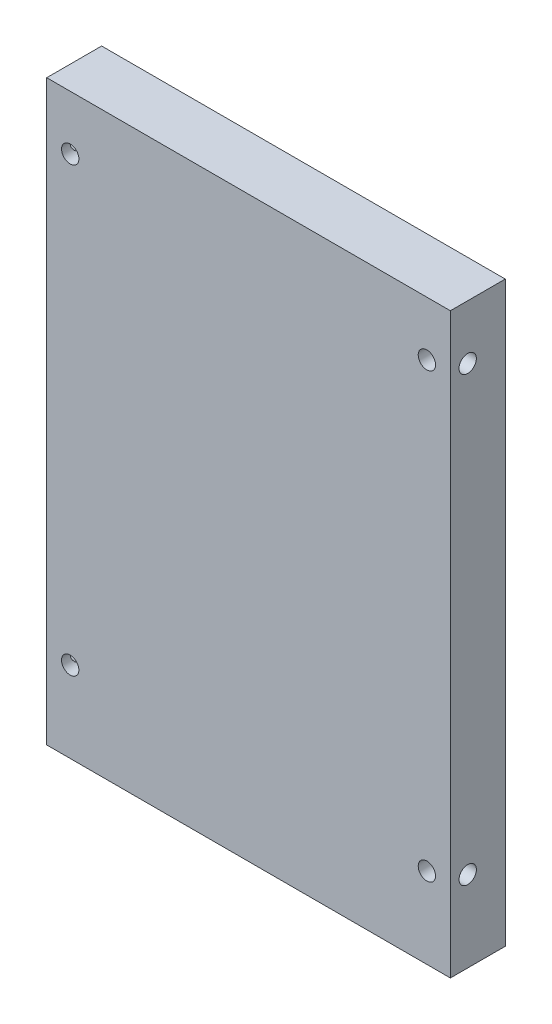
ISO-10303-21;
HEADER;
FILE_DESCRIPTION(('STEP AP214'),'2;1');
FILE_NAME('part.step','',(''),(''),'','','');
FILE_SCHEMA(('AUTOMOTIVE_DESIGN { 1 0 10303 214 1 1 1 1 }'));
ENDSEC;
DATA;
#1=APPLICATION_CONTEXT('core data for automotive mechanical design processes');
#2=APPLICATION_PROTOCOL_DEFINITION('international standard','automotive_design',2000,#1);
#3=PRODUCT_CONTEXT('',#1,'mechanical');
#4=PRODUCT('Part','Part','',(#3));
#5=PRODUCT_RELATED_PRODUCT_CATEGORY('part','',(#4));
#6=PRODUCT_DEFINITION_FORMATION('','',#4);
#7=PRODUCT_DEFINITION_CONTEXT('part definition',#1,'design');
#8=PRODUCT_DEFINITION('design','',#6,#7);
#9=PRODUCT_DEFINITION_SHAPE('','',#8);
#10=(LENGTH_UNIT() NAMED_UNIT(*) SI_UNIT(.MILLI.,.METRE.));
#11=(NAMED_UNIT(*) PLANE_ANGLE_UNIT() SI_UNIT($,.RADIAN.));
#12=(NAMED_UNIT(*) SI_UNIT($,.STERADIAN.) SOLID_ANGLE_UNIT());
#13=UNCERTAINTY_MEASURE_WITH_UNIT(LENGTH_MEASURE(1.E-05),#10,'distance_accuracy_value','');
#14=(GEOMETRIC_REPRESENTATION_CONTEXT(3) GLOBAL_UNCERTAINTY_ASSIGNED_CONTEXT((#13)) GLOBAL_UNIT_ASSIGNED_CONTEXT((#10,
#11,#12)) REPRESENTATION_CONTEXT('',''));
#15=CARTESIAN_POINT('',(0.,0.,0.));
#16=DIRECTION('',(0.,0.,1.));
#17=DIRECTION('',(1.,0.,0.));
#18=AXIS2_PLACEMENT_3D('',#15,#16,#17);
#19=CARTESIAN_POINT('',(0.,0.,9.5));
#20=DIRECTION('',(-1.,0.,0.));
#21=DIRECTION('',(0.,0.,1.));
#22=AXIS2_PLACEMENT_3D('',#19,#20,#21);
#23=PLANE('',#22);
#24=CARTESIAN_POINT('',(0.,14.,6.49999999999999));
#25=DIRECTION('',(1.,0.,0.));
#26=DIRECTION('',(0.,0.,1.));
#27=AXIS2_PLACEMENT_3D('',#24,#25,#26);
#28=CIRCLE('',#27,1.50000000000002);
#29=CARTESIAN_POINT('',(0.,14.,8.00000000000001));
#30=VERTEX_POINT('',#29);
#31=EDGE_CURVE('E204',#30,#30,#28,.T.);
#32=ORIENTED_EDGE('',*,*,#31,.T.);
#33=EDGE_LOOP('',(#32));
#34=FACE_BOUND('',#33,.T.);
#35=CARTESIAN_POINT('',(0.,90.6,6.5));
#36=DIRECTION('',(1.,0.,0.));
#37=DIRECTION('',(0.,0.,-1.));
#38=AXIS2_PLACEMENT_3D('',#35,#36,#37);
#39=CIRCLE('',#38,1.50000000000001);
#40=CARTESIAN_POINT('',(0.,90.6,4.99999999999999));
#41=VERTEX_POINT('',#40);
#42=EDGE_CURVE('E198',#41,#41,#39,.T.);
#43=ORIENTED_EDGE('',*,*,#42,.T.);
#44=EDGE_LOOP('',(#43));
#45=FACE_BOUND('',#44,.T.);
#46=DIRECTION('',(0.,1.,0.));
#47=VECTOR('',#46,1.);
#48=CARTESIAN_POINT('',(0.,0.,0.));
#49=LINE('',#48,#47);
#50=CARTESIAN_POINT('',(0.,0.,0.));
#51=VERTEX_POINT('',#50);
#52=CARTESIAN_POINT('',(0.,100.,0.));
#53=VERTEX_POINT('',#52);
#54=EDGE_CURVE('E176',#51,#53,#49,.T.);
#55=ORIENTED_EDGE('',*,*,#54,.F.);
#56=DIRECTION('',(0.,0.,-1.));
#57=VECTOR('',#56,1.);
#58=CARTESIAN_POINT('',(0.,0.,9.5));
#59=LINE('',#58,#57);
#60=CARTESIAN_POINT('',(0.,0.,9.5));
#61=VERTEX_POINT('',#60);
#62=EDGE_CURVE('E157',#61,#51,#59,.T.);
#63=ORIENTED_EDGE('',*,*,#62,.F.);
#64=DIRECTION('',(0.,1.,0.));
#65=VECTOR('',#64,1.);
#66=CARTESIAN_POINT('',(0.,0.,9.5));
#67=LINE('',#66,#65);
#68=CARTESIAN_POINT('',(0.,100.,9.5));
#69=VERTEX_POINT('',#68);
#70=EDGE_CURVE('E169',#61,#69,#67,.T.);
#71=ORIENTED_EDGE('',*,*,#70,.T.);
#72=DIRECTION('',(0.,0.,-1.));
#73=VECTOR('',#72,1.);
#74=CARTESIAN_POINT('',(0.,100.,9.5));
#75=LINE('',#74,#73);
#76=EDGE_CURVE('E158',#69,#53,#75,.T.);
#77=ORIENTED_EDGE('',*,*,#76,.T.);
#78=EDGE_LOOP('',(#55,#63,#71,#77));
#79=FACE_BOUND('',#78,.T.);
#80=ADVANCED_FACE('F33',(#34,#45,#79),#23,.T.);
#81=CARTESIAN_POINT('',(0.,0.,9.5));
#82=DIRECTION('',(0.,1.,0.));
#83=DIRECTION('',(0.,0.,1.));
#84=AXIS2_PLACEMENT_3D('',#81,#82,#83);
#85=PLANE('',#84);
#86=DIRECTION('',(1.,0.,0.));
#87=VECTOR('',#86,1.);
#88=CARTESIAN_POINT('',(0.,0.,0.));
#89=LINE('',#88,#87);
#90=CARTESIAN_POINT('',(69.85,0.,0.));
#91=VERTEX_POINT('',#90);
#92=EDGE_CURVE('E167',#51,#91,#89,.T.);
#93=ORIENTED_EDGE('',*,*,#92,.T.);
#94=DIRECTION('',(0.,0.,-1.));
#95=VECTOR('',#94,1.);
#96=CARTESIAN_POINT('',(69.85,0.,9.5));
#97=LINE('',#96,#95);
#98=CARTESIAN_POINT('',(69.85,0.,9.5));
#99=VERTEX_POINT('',#98);
#100=EDGE_CURVE('E163',#99,#91,#97,.T.);
#101=ORIENTED_EDGE('',*,*,#100,.F.);
#102=DIRECTION('',(1.,0.,0.));
#103=VECTOR('',#102,1.);
#104=CARTESIAN_POINT('',(0.,0.,9.5));
#105=LINE('',#104,#103);
#106=EDGE_CURVE('E161',#61,#99,#105,.T.);
#107=ORIENTED_EDGE('',*,*,#106,.F.);
#108=ORIENTED_EDGE('',*,*,#62,.T.);
#109=EDGE_LOOP('',(#93,#101,#107,#108));
#110=FACE_BOUND('',#109,.T.);
#111=ADVANCED_FACE('F256',(#110),#85,.F.);
#112=CARTESIAN_POINT('',(69.85,0.,9.5));
#113=DIRECTION('',(-1.,0.,0.));
#114=DIRECTION('',(0.,0.,1.));
#115=AXIS2_PLACEMENT_3D('',#112,#113,#114);
#116=PLANE('',#115);
#117=CARTESIAN_POINT('',(69.85,14.,6.49999999999999));
#118=DIRECTION('',(1.,0.,0.));
#119=DIRECTION('',(0.,0.,1.));
#120=AXIS2_PLACEMENT_3D('',#117,#118,#119);
#121=CIRCLE('',#120,1.50000000000002);
#122=CARTESIAN_POINT('',(69.85,14.,8.00000000000001));
#123=VERTEX_POINT('',#122);
#124=EDGE_CURVE('E193',#123,#123,#121,.T.);
#125=ORIENTED_EDGE('',*,*,#124,.F.);
#126=EDGE_LOOP('',(#125));
#127=FACE_BOUND('',#126,.T.);
#128=CARTESIAN_POINT('',(69.85,90.6,6.5));
#129=DIRECTION('',(1.,0.,0.));
#130=DIRECTION('',(0.,0.,-1.));
#131=AXIS2_PLACEMENT_3D('',#128,#129,#130);
#132=CIRCLE('',#131,1.50000000000001);
#133=CARTESIAN_POINT('',(69.85,90.6,4.99999999999999));
#134=VERTEX_POINT('',#133);
#135=EDGE_CURVE('E188',#134,#134,#132,.T.);
#136=ORIENTED_EDGE('',*,*,#135,.F.);
#137=EDGE_LOOP('',(#136));
#138=FACE_BOUND('',#137,.T.);
#139=DIRECTION('',(0.,1.,0.));
#140=VECTOR('',#139,1.);
#141=CARTESIAN_POINT('',(69.85,0.,0.));
#142=LINE('',#141,#140);
#143=CARTESIAN_POINT('',(69.85,100.,0.));
#144=VERTEX_POINT('',#143);
#145=EDGE_CURVE('E170',#91,#144,#142,.T.);
#146=ORIENTED_EDGE('',*,*,#145,.T.);
#147=DIRECTION('',(0.,0.,-1.));
#148=VECTOR('',#147,1.);
#149=CARTESIAN_POINT('',(69.85,100.,9.5));
#150=LINE('',#149,#148);
#151=CARTESIAN_POINT('',(69.85,100.,9.5));
#152=VERTEX_POINT('',#151);
#153=EDGE_CURVE('E160',#152,#144,#150,.T.);
#154=ORIENTED_EDGE('',*,*,#153,.F.);
#155=DIRECTION('',(0.,1.,0.));
#156=VECTOR('',#155,1.);
#157=CARTESIAN_POINT('',(69.85,0.,9.5));
#158=LINE('',#157,#156);
#159=EDGE_CURVE('E181',#99,#152,#158,.T.);
#160=ORIENTED_EDGE('',*,*,#159,.F.);
#161=ORIENTED_EDGE('',*,*,#100,.T.);
#162=EDGE_LOOP('',(#146,#154,#160,#161));
#163=FACE_BOUND('',#162,.T.);
#164=ADVANCED_FACE('F261',(#127,#138,#163),#116,.F.);
#165=CARTESIAN_POINT('',(0.,100.,9.5));
#166=DIRECTION('',(0.,1.,0.));
#167=DIRECTION('',(0.,0.,1.));
#168=AXIS2_PLACEMENT_3D('',#165,#166,#167);
#169=PLANE('',#168);
#170=DIRECTION('',(1.,0.,0.));
#171=VECTOR('',#170,1.);
#172=CARTESIAN_POINT('',(0.,100.,0.));
#173=LINE('',#172,#171);
#174=EDGE_CURVE('E173',#53,#144,#173,.T.);
#175=ORIENTED_EDGE('',*,*,#174,.F.);
#176=ORIENTED_EDGE('',*,*,#76,.F.);
#177=DIRECTION('',(1.,0.,0.));
#178=VECTOR('',#177,1.);
#179=CARTESIAN_POINT('',(0.,100.,9.5));
#180=LINE('',#179,#178);
#181=EDGE_CURVE('E183',#69,#152,#180,.T.);
#182=ORIENTED_EDGE('',*,*,#181,.T.);
#183=ORIENTED_EDGE('',*,*,#153,.T.);
#184=EDGE_LOOP('',(#175,#176,#182,#183));
#185=FACE_BOUND('',#184,.T.);
#186=ADVANCED_FACE('F239',(#185),#169,.T.);
#187=CARTESIAN_POINT('',(0.,0.,9.5));
#188=DIRECTION('',(0.,0.,-1.));
#189=DIRECTION('',(-1.,0.,0.));
#190=AXIS2_PLACEMENT_3D('',#187,#188,#189);
#191=PLANE('',#190);
#192=CARTESIAN_POINT('',(65.785,14.,9.5));
#193=DIRECTION('',(0.,0.,1.));
#194=DIRECTION('',(-1.,0.,0.));
#195=AXIS2_PLACEMENT_3D('',#192,#193,#194);
#196=CIRCLE('',#195,1.5);
#197=CARTESIAN_POINT('',(64.285,14.,9.5));
#198=VERTEX_POINT('',#197);
#199=EDGE_CURVE('E129',#198,#198,#196,.T.);
#200=ORIENTED_EDGE('',*,*,#199,.F.);
#201=EDGE_LOOP('',(#200));
#202=FACE_BOUND('',#201,.T.);
#203=CARTESIAN_POINT('',(65.785,90.6,9.5));
#204=DIRECTION('',(0.,0.,1.));
#205=DIRECTION('',(-1.,0.,0.));
#206=AXIS2_PLACEMENT_3D('',#203,#204,#205);
#207=CIRCLE('',#206,1.5);
#208=CARTESIAN_POINT('',(64.285,90.6,9.5));
#209=VERTEX_POINT('',#208);
#210=EDGE_CURVE('E226',#209,#209,#207,.T.);
#211=ORIENTED_EDGE('',*,*,#210,.F.);
#212=EDGE_LOOP('',(#211));
#213=FACE_BOUND('',#212,.T.);
#214=CARTESIAN_POINT('',(4.065,14.,9.5));
#215=DIRECTION('',(0.,0.,1.));
#216=DIRECTION('',(1.,0.,0.));
#217=AXIS2_PLACEMENT_3D('',#214,#215,#216);
#218=CIRCLE('',#217,1.5);
#219=CARTESIAN_POINT('',(5.565,14.,9.5));
#220=VERTEX_POINT('',#219);
#221=EDGE_CURVE('E219',#220,#220,#218,.T.);
#222=ORIENTED_EDGE('',*,*,#221,.F.);
#223=EDGE_LOOP('',(#222));
#224=FACE_BOUND('',#223,.T.);
#225=CARTESIAN_POINT('',(4.065,90.6,9.5));
#226=DIRECTION('',(0.,0.,1.));
#227=DIRECTION('',(1.,0.,0.));
#228=AXIS2_PLACEMENT_3D('',#225,#226,#227);
#229=CIRCLE('',#228,1.5);
#230=CARTESIAN_POINT('',(5.565,90.6,9.5));
#231=VERTEX_POINT('',#230);
#232=EDGE_CURVE('E212',#231,#231,#229,.T.);
#233=ORIENTED_EDGE('',*,*,#232,.F.);
#234=EDGE_LOOP('',(#233));
#235=FACE_BOUND('',#234,.T.);
#236=ORIENTED_EDGE('',*,*,#70,.F.);
#237=ORIENTED_EDGE('',*,*,#106,.T.);
#238=ORIENTED_EDGE('',*,*,#159,.T.);
#239=ORIENTED_EDGE('',*,*,#181,.F.);
#240=EDGE_LOOP('',(#236,#237,#238,#239));
#241=FACE_BOUND('',#240,.T.);
#242=ADVANCED_FACE('F235',(#202,#213,#224,#235,#241),#191,.F.);
#243=CARTESIAN_POINT('',(0.,0.,0.));
#244=DIRECTION('',(0.,0.,-1.));
#245=DIRECTION('',(-1.,0.,0.));
#246=AXIS2_PLACEMENT_3D('',#243,#244,#245);
#247=PLANE('',#246);
#248=ORIENTED_EDGE('',*,*,#54,.T.);
#249=ORIENTED_EDGE('',*,*,#174,.T.);
#250=ORIENTED_EDGE('',*,*,#145,.F.);
#251=ORIENTED_EDGE('',*,*,#92,.F.);
#252=EDGE_LOOP('',(#248,#249,#250,#251));
#253=FACE_BOUND('',#252,.T.);
#254=ADVANCED_FACE('F238',(#253),#247,.T.);
#255=CARTESIAN_POINT('',(66.85,90.6,6.5));
#256=DIRECTION('',(1.,0.,0.));
#257=DIRECTION('',(0.,0.,-1.));
#258=AXIS2_PLACEMENT_3D('',#255,#256,#257);
#259=CYLINDRICAL_SURFACE('',#258,1.50000000000001);
#260=CARTESIAN_POINT('',(66.85,90.6,6.5));
#261=DIRECTION('',(1.,0.,0.));
#262=DIRECTION('',(0.,0.,-1.));
#263=AXIS2_PLACEMENT_3D('',#260,#261,#262);
#264=CIRCLE('',#263,1.50000000000001);
#265=CARTESIAN_POINT('',(66.85,89.5436974865125,7.565));
#266=VERTEX_POINT('',#265);
#267=CARTESIAN_POINT('',(66.85,91.6563025134875,7.565));
#268=VERTEX_POINT('',#267);
#269=EDGE_CURVE('E179',#266,#268,#264,.T.);
#270=ORIENTED_EDGE('',*,*,#269,.F.);
#271=CARTESIAN_POINT('',(65.785,90.6,6.5));
#272=DIRECTION('',(0.707106781186547,0.,-0.707106781186547));
#273=DIRECTION('',(0.707106781186547,0.,0.707106781186547));
#274=AXIS2_PLACEMENT_3D('',#271,#272,#273);
#275=ELLIPSE('',#274,2.12132034355964,1.5);
#276=EDGE_CURVE('E222',#266,#268,#275,.F.);
#277=ORIENTED_EDGE('',*,*,#276,.T.);
#278=EDGE_LOOP('',(#270,#277));
#279=FACE_BOUND('',#278,.T.);
#280=ORIENTED_EDGE('',*,*,#135,.T.);
#281=EDGE_LOOP('',(#280));
#282=FACE_BOUND('',#281,.T.);
#283=ADVANCED_FACE('F265',(#279,#282),#259,.F.);
#284=CARTESIAN_POINT('',(66.85,90.6,6.5));
#285=DIRECTION('',(1.,0.,0.));
#286=DIRECTION('',(0.,0.,-1.));
#287=AXIS2_PLACEMENT_3D('',#284,#285,#286);
#288=PLANE('',#287);
#289=DIRECTION('',(0.,0.,1.));
#290=VECTOR('',#289,1.);
#291=CARTESIAN_POINT('',(66.85,91.6563025134875,6.5));
#292=LINE('',#291,#290);
#293=CARTESIAN_POINT('',(66.85,91.6563025134875,6.5));
#294=VERTEX_POINT('',#293);
#295=EDGE_CURVE('E123',#294,#268,#292,.T.);
#296=ORIENTED_EDGE('',*,*,#295,.F.);
#297=DIRECTION('',(0.,1.,0.));
#298=VECTOR('',#297,1.);
#299=CARTESIAN_POINT('',(66.85,90.6,6.5));
#300=LINE('',#299,#298);
#301=CARTESIAN_POINT('',(66.85,89.5436974865125,6.5));
#302=VERTEX_POINT('',#301);
#303=EDGE_CURVE('E139',#302,#294,#300,.T.);
#304=ORIENTED_EDGE('',*,*,#303,.F.);
#305=DIRECTION('',(0.,0.,1.));
#306=VECTOR('',#305,1.);
#307=CARTESIAN_POINT('',(66.85,89.5436974865125,6.5));
#308=LINE('',#307,#306);
#309=EDGE_CURVE('E137',#266,#302,#308,.F.);
#310=ORIENTED_EDGE('',*,*,#309,.F.);
#311=ORIENTED_EDGE('',*,*,#269,.T.);
#312=EDGE_LOOP('',(#296,#304,#310,#311));
#313=FACE_BOUND('',#312,.T.);
#314=ADVANCED_FACE('F270',(#313),#288,.T.);
#315=CARTESIAN_POINT('',(66.85,14.,6.49999999999999));
#316=DIRECTION('',(1.,0.,0.));
#317=DIRECTION('',(0.,0.,-1.));
#318=AXIS2_PLACEMENT_3D('',#315,#316,#317);
#319=CYLINDRICAL_SURFACE('',#318,1.50000000000002);
#320=CARTESIAN_POINT('',(66.85,14.,6.49999999999999));
#321=DIRECTION('',(1.,0.,0.));
#322=DIRECTION('',(0.,0.,1.));
#323=AXIS2_PLACEMENT_3D('',#320,#321,#322);
#324=CIRCLE('',#323,1.50000000000002);
#325=CARTESIAN_POINT('',(66.85,12.9436974865125,7.56499999999999));
#326=VERTEX_POINT('',#325);
#327=CARTESIAN_POINT('',(66.85,15.0563025134875,7.56500000000001));
#328=VERTEX_POINT('',#327);
#329=EDGE_CURVE('E134',#326,#328,#324,.T.);
#330=ORIENTED_EDGE('',*,*,#329,.F.);
#331=CARTESIAN_POINT('',(65.785,14.,6.49999999999999));
#332=DIRECTION('',(0.707106781186547,0.,-0.707106781186547));
#333=DIRECTION('',(0.707106781186547,0.,0.707106781186547));
#334=AXIS2_PLACEMENT_3D('',#331,#332,#333);
#335=ELLIPSE('',#334,2.12132034355965,1.50000000000001);
#336=EDGE_CURVE('E128',#326,#328,#335,.F.);
#337=ORIENTED_EDGE('',*,*,#336,.T.);
#338=EDGE_LOOP('',(#330,#337));
#339=FACE_BOUND('',#338,.T.);
#340=ORIENTED_EDGE('',*,*,#124,.T.);
#341=EDGE_LOOP('',(#340));
#342=FACE_BOUND('',#341,.T.);
#343=ADVANCED_FACE('F295',(#339,#342),#319,.F.);
#344=CARTESIAN_POINT('',(66.85,14.,6.49999999999999));
#345=DIRECTION('',(-1.,0.,0.));
#346=DIRECTION('',(0.,0.,1.));
#347=AXIS2_PLACEMENT_3D('',#344,#345,#346);
#348=PLANE('',#347);
#349=DIRECTION('',(0.,-1.,0.));
#350=VECTOR('',#349,1.);
#351=CARTESIAN_POINT('',(66.85,14.,6.5));
#352=LINE('',#351,#350);
#353=CARTESIAN_POINT('',(66.85,15.0563025134875,6.5));
#354=VERTEX_POINT('',#353);
#355=CARTESIAN_POINT('',(66.85,12.9436974865125,6.5));
#356=VERTEX_POINT('',#355);
#357=EDGE_CURVE('E119',#354,#356,#352,.T.);
#358=ORIENTED_EDGE('',*,*,#357,.T.);
#359=DIRECTION('',(0.,0.,1.));
#360=VECTOR('',#359,1.);
#361=CARTESIAN_POINT('',(66.85,12.9436974865125,6.5));
#362=LINE('',#361,#360);
#363=EDGE_CURVE('E11',#356,#326,#362,.T.);
#364=ORIENTED_EDGE('',*,*,#363,.T.);
#365=ORIENTED_EDGE('',*,*,#329,.T.);
#366=DIRECTION('',(0.,0.,1.));
#367=VECTOR('',#366,1.);
#368=CARTESIAN_POINT('',(66.85,15.0563025134875,6.5));
#369=LINE('',#368,#367);
#370=EDGE_CURVE('E40',#328,#354,#369,.F.);
#371=ORIENTED_EDGE('',*,*,#370,.T.);
#372=EDGE_LOOP('',(#358,#364,#365,#371));
#373=FACE_BOUND('',#372,.T.);
#374=ADVANCED_FACE('F132',(#373),#348,.F.);
#375=CARTESIAN_POINT('',(3.,90.6,6.5));
#376=DIRECTION('',(-1.,0.,0.));
#377=DIRECTION('',(0.,0.,1.));
#378=AXIS2_PLACEMENT_3D('',#375,#376,#377);
#379=CYLINDRICAL_SURFACE('',#378,1.50000000000001);
#380=CARTESIAN_POINT('',(4.065,90.6,6.5));
#381=DIRECTION('',(-0.707106781186547,0.,-0.707106781186547));
#382=DIRECTION('',(-0.707106781186547,0.,0.707106781186547));
#383=AXIS2_PLACEMENT_3D('',#380,#381,#382);
#384=ELLIPSE('',#383,2.12132034355965,1.5);
#385=CARTESIAN_POINT('',(3.,89.5436974865125,7.565));
#386=VERTEX_POINT('',#385);
#387=CARTESIAN_POINT('',(3.,91.6563025134875,7.565));
#388=VERTEX_POINT('',#387);
#389=EDGE_CURVE('E207',#386,#388,#384,.T.);
#390=ORIENTED_EDGE('',*,*,#389,.F.);
#391=CARTESIAN_POINT('',(3.,90.6,6.5));
#392=DIRECTION('',(1.,0.,0.));
#393=DIRECTION('',(0.,0.,-1.));
#394=AXIS2_PLACEMENT_3D('',#391,#392,#393);
#395=CIRCLE('',#394,1.50000000000001);
#396=EDGE_CURVE('E196',#386,#388,#395,.T.);
#397=ORIENTED_EDGE('',*,*,#396,.T.);
#398=EDGE_LOOP('',(#390,#397));
#399=FACE_BOUND('',#398,.T.);
#400=ORIENTED_EDGE('',*,*,#42,.F.);
#401=EDGE_LOOP('',(#400));
#402=FACE_BOUND('',#401,.T.);
#403=ADVANCED_FACE('F283',(#399,#402),#379,.F.);
#404=CARTESIAN_POINT('',(3.,90.6,6.5));
#405=DIRECTION('',(-1.,0.,0.));
#406=DIRECTION('',(0.,0.,-1.));
#407=AXIS2_PLACEMENT_3D('',#404,#405,#406);
#408=PLANE('',#407);
#409=DIRECTION('',(0.,0.,1.));
#410=VECTOR('',#409,1.);
#411=CARTESIAN_POINT('',(3.,89.5436974865125,6.5));
#412=LINE('',#411,#410);
#413=CARTESIAN_POINT('',(3.,89.5436974865125,6.5));
#414=VERTEX_POINT('',#413);
#415=EDGE_CURVE('E149',#414,#386,#412,.T.);
#416=ORIENTED_EDGE('',*,*,#415,.F.);
#417=DIRECTION('',(0.,1.,0.));
#418=VECTOR('',#417,1.);
#419=CARTESIAN_POINT('',(3.,90.6,6.5));
#420=LINE('',#419,#418);
#421=CARTESIAN_POINT('',(3.,91.6563025134875,6.5));
#422=VERTEX_POINT('',#421);
#423=EDGE_CURVE('E154',#414,#422,#420,.T.);
#424=ORIENTED_EDGE('',*,*,#423,.T.);
#425=DIRECTION('',(0.,0.,1.));
#426=VECTOR('',#425,1.);
#427=CARTESIAN_POINT('',(3.,91.6563025134875,6.5));
#428=LINE('',#427,#426);
#429=EDGE_CURVE('E151',#388,#422,#428,.F.);
#430=ORIENTED_EDGE('',*,*,#429,.F.);
#431=ORIENTED_EDGE('',*,*,#396,.F.);
#432=EDGE_LOOP('',(#416,#424,#430,#431));
#433=FACE_BOUND('',#432,.T.);
#434=ADVANCED_FACE('F285',(#433),#408,.T.);
#435=CARTESIAN_POINT('',(3.,14.,6.49999999999999));
#436=DIRECTION('',(-1.,0.,0.));
#437=DIRECTION('',(0.,0.,1.));
#438=AXIS2_PLACEMENT_3D('',#435,#436,#437);
#439=CYLINDRICAL_SURFACE('',#438,1.50000000000002);
#440=CARTESIAN_POINT('',(4.065,14.,6.49999999999999));
#441=DIRECTION('',(-0.707106781186547,0.,-0.707106781186547));
#442=DIRECTION('',(-0.707106781186547,0.,0.707106781186547));
#443=AXIS2_PLACEMENT_3D('',#440,#441,#442);
#444=ELLIPSE('',#443,2.12132034355966,1.50000000000001);
#445=CARTESIAN_POINT('',(3.,12.9436974865125,7.56500000000001));
#446=VERTEX_POINT('',#445);
#447=CARTESIAN_POINT('',(3.,15.0563025134875,7.56499999999999));
#448=VERTEX_POINT('',#447);
#449=EDGE_CURVE('E215',#446,#448,#444,.T.);
#450=ORIENTED_EDGE('',*,*,#449,.F.);
#451=CARTESIAN_POINT('',(3.,14.,6.49999999999999));
#452=DIRECTION('',(1.,0.,0.));
#453=DIRECTION('',(0.,0.,1.));
#454=AXIS2_PLACEMENT_3D('',#451,#452,#453);
#455=CIRCLE('',#454,1.50000000000002);
#456=EDGE_CURVE('E201',#446,#448,#455,.T.);
#457=ORIENTED_EDGE('',*,*,#456,.T.);
#458=EDGE_LOOP('',(#450,#457));
#459=FACE_BOUND('',#458,.T.);
#460=ORIENTED_EDGE('',*,*,#31,.F.);
#461=EDGE_LOOP('',(#460));
#462=FACE_BOUND('',#461,.T.);
#463=ADVANCED_FACE('F292',(#459,#462),#439,.F.);
#464=CARTESIAN_POINT('',(3.,14.,6.49999999999999));
#465=DIRECTION('',(1.,0.,0.));
#466=DIRECTION('',(0.,0.,1.));
#467=AXIS2_PLACEMENT_3D('',#464,#465,#466);
#468=PLANE('',#467);
#469=DIRECTION('',(0.,-1.,0.));
#470=VECTOR('',#469,1.);
#471=CARTESIAN_POINT('',(3.,14.,6.5));
#472=LINE('',#471,#470);
#473=CARTESIAN_POINT('',(3.,15.0563025134875,6.5));
#474=VERTEX_POINT('',#473);
#475=CARTESIAN_POINT('',(3.,12.9436974865125,6.5));
#476=VERTEX_POINT('',#475);
#477=EDGE_CURVE('E147',#474,#476,#472,.T.);
#478=ORIENTED_EDGE('',*,*,#477,.F.);
#479=DIRECTION('',(0.,0.,1.));
#480=VECTOR('',#479,1.);
#481=CARTESIAN_POINT('',(3.,15.0563025134875,6.5));
#482=LINE('',#481,#480);
#483=EDGE_CURVE('E141',#474,#448,#482,.T.);
#484=ORIENTED_EDGE('',*,*,#483,.T.);
#485=ORIENTED_EDGE('',*,*,#456,.F.);
#486=DIRECTION('',(0.,0.,1.));
#487=VECTOR('',#486,1.);
#488=CARTESIAN_POINT('',(3.,12.9436974865125,6.5));
#489=LINE('',#488,#487);
#490=EDGE_CURVE('E144',#446,#476,#489,.F.);
#491=ORIENTED_EDGE('',*,*,#490,.T.);
#492=EDGE_LOOP('',(#478,#484,#485,#491));
#493=FACE_BOUND('',#492,.T.);
#494=ADVANCED_FACE('F376',(#493),#468,.F.);
#495=CARTESIAN_POINT('',(4.065,90.6,6.5));
#496=DIRECTION('',(0.,0.,1.));
#497=DIRECTION('',(1.,0.,0.));
#498=AXIS2_PLACEMENT_3D('',#495,#496,#497);
#499=CYLINDRICAL_SURFACE('',#498,1.5);
#500=ORIENTED_EDGE('',*,*,#415,.T.);
#501=ORIENTED_EDGE('',*,*,#389,.T.);
#502=ORIENTED_EDGE('',*,*,#429,.T.);
#503=CARTESIAN_POINT('',(4.065,90.6,6.5));
#504=DIRECTION('',(0.,0.,1.));
#505=DIRECTION('',(1.,0.,0.));
#506=AXIS2_PLACEMENT_3D('',#503,#504,#505);
#507=CIRCLE('',#506,1.5);
#508=EDGE_CURVE('E211',#414,#422,#507,.T.);
#509=ORIENTED_EDGE('',*,*,#508,.F.);
#510=EDGE_LOOP('',(#500,#501,#502,#509));
#511=FACE_BOUND('',#510,.T.);
#512=ORIENTED_EDGE('',*,*,#232,.T.);
#513=EDGE_LOOP('',(#512));
#514=FACE_BOUND('',#513,.T.);
#515=ADVANCED_FACE('F385',(#511,#514),#499,.F.);
#516=CARTESIAN_POINT('',(4.065,90.6,6.5));
#517=DIRECTION('',(0.,0.,1.));
#518=DIRECTION('',(1.,0.,0.));
#519=AXIS2_PLACEMENT_3D('',#516,#517,#518);
#520=PLANE('',#519);
#521=ORIENTED_EDGE('',*,*,#508,.T.);
#522=ORIENTED_EDGE('',*,*,#423,.F.);
#523=EDGE_LOOP('',(#521,#522));
#524=FACE_BOUND('',#523,.T.);
#525=ADVANCED_FACE('F395',(#524),#520,.T.);
#526=CARTESIAN_POINT('',(4.065,14.,6.5));
#527=DIRECTION('',(0.,0.,1.));
#528=DIRECTION('',(1.,0.,0.));
#529=AXIS2_PLACEMENT_3D('',#526,#527,#528);
#530=CYLINDRICAL_SURFACE('',#529,1.5);
#531=ORIENTED_EDGE('',*,*,#221,.T.);
#532=EDGE_LOOP('',(#531));
#533=FACE_BOUND('',#532,.T.);
#534=CARTESIAN_POINT('',(4.065,14.,6.5));
#535=DIRECTION('',(0.,0.,1.));
#536=DIRECTION('',(1.,0.,0.));
#537=AXIS2_PLACEMENT_3D('',#534,#535,#536);
#538=CIRCLE('',#537,1.5);
#539=EDGE_CURVE('E218',#476,#474,#538,.T.);
#540=ORIENTED_EDGE('',*,*,#539,.F.);
#541=ORIENTED_EDGE('',*,*,#490,.F.);
#542=ORIENTED_EDGE('',*,*,#449,.T.);
#543=ORIENTED_EDGE('',*,*,#483,.F.);
#544=EDGE_LOOP('',(#540,#541,#542,#543));
#545=FACE_BOUND('',#544,.T.);
#546=ADVANCED_FACE('F405',(#533,#545),#530,.F.);
#547=CARTESIAN_POINT('',(4.065,14.,6.5));
#548=DIRECTION('',(0.,0.,1.));
#549=DIRECTION('',(1.,0.,0.));
#550=AXIS2_PLACEMENT_3D('',#547,#548,#549);
#551=PLANE('',#550);
#552=ORIENTED_EDGE('',*,*,#477,.T.);
#553=ORIENTED_EDGE('',*,*,#539,.T.);
#554=EDGE_LOOP('',(#552,#553));
#555=FACE_BOUND('',#554,.T.);
#556=ADVANCED_FACE('F415',(#555),#551,.T.);
#557=CARTESIAN_POINT('',(65.785,90.6,6.5));
#558=DIRECTION('',(0.,0.,1.));
#559=DIRECTION('',(1.,0.,0.));
#560=AXIS2_PLACEMENT_3D('',#557,#558,#559);
#561=CYLINDRICAL_SURFACE('',#560,1.5);
#562=ORIENTED_EDGE('',*,*,#295,.T.);
#563=ORIENTED_EDGE('',*,*,#276,.F.);
#564=ORIENTED_EDGE('',*,*,#309,.T.);
#565=CARTESIAN_POINT('',(65.785,90.6,6.5));
#566=DIRECTION('',(0.,0.,1.));
#567=DIRECTION('',(-1.,0.,0.));
#568=AXIS2_PLACEMENT_3D('',#565,#566,#567);
#569=CIRCLE('',#568,1.5);
#570=EDGE_CURVE('E53',#294,#302,#569,.T.);
#571=ORIENTED_EDGE('',*,*,#570,.F.);
#572=EDGE_LOOP('',(#562,#563,#564,#571));
#573=FACE_BOUND('',#572,.T.);
#574=ORIENTED_EDGE('',*,*,#210,.T.);
#575=EDGE_LOOP('',(#574));
#576=FACE_BOUND('',#575,.T.);
#577=ADVANCED_FACE('F312',(#573,#576),#561,.F.);
#578=CARTESIAN_POINT('',(65.785,90.6,6.5));
#579=DIRECTION('',(0.,0.,-1.));
#580=DIRECTION('',(-1.,0.,0.));
#581=AXIS2_PLACEMENT_3D('',#578,#579,#580);
#582=PLANE('',#581);
#583=ORIENTED_EDGE('',*,*,#303,.T.);
#584=ORIENTED_EDGE('',*,*,#570,.T.);
#585=EDGE_LOOP('',(#583,#584));
#586=FACE_BOUND('',#585,.T.);
#587=ADVANCED_FACE('F434',(#586),#582,.F.);
#588=CARTESIAN_POINT('',(65.785,14.,6.5));
#589=DIRECTION('',(0.,0.,1.));
#590=DIRECTION('',(1.,0.,0.));
#591=AXIS2_PLACEMENT_3D('',#588,#589,#590);
#592=CYLINDRICAL_SURFACE('',#591,1.5);
#593=ORIENTED_EDGE('',*,*,#199,.T.);
#594=EDGE_LOOP('',(#593));
#595=FACE_BOUND('',#594,.T.);
#596=CARTESIAN_POINT('',(65.785,14.,6.5));
#597=DIRECTION('',(0.,0.,1.));
#598=DIRECTION('',(-1.,0.,0.));
#599=AXIS2_PLACEMENT_3D('',#596,#597,#598);
#600=CIRCLE('',#599,1.5);
#601=EDGE_CURVE('E46',#354,#356,#600,.T.);
#602=ORIENTED_EDGE('',*,*,#601,.F.);
#603=ORIENTED_EDGE('',*,*,#370,.F.);
#604=ORIENTED_EDGE('',*,*,#336,.F.);
#605=ORIENTED_EDGE('',*,*,#363,.F.);
#606=EDGE_LOOP('',(#602,#603,#604,#605));
#607=FACE_BOUND('',#606,.T.);
#608=ADVANCED_FACE('F126',(#595,#607),#592,.F.);
#609=CARTESIAN_POINT('',(65.785,14.,6.5));
#610=DIRECTION('',(0.,0.,-1.));
#611=DIRECTION('',(-1.,0.,0.));
#612=AXIS2_PLACEMENT_3D('',#609,#610,#611);
#613=PLANE('',#612);
#614=ORIENTED_EDGE('',*,*,#601,.T.);
#615=ORIENTED_EDGE('',*,*,#357,.F.);
#616=EDGE_LOOP('',(#614,#615));
#617=FACE_BOUND('',#616,.T.);
#618=ADVANCED_FACE('F120',(#617),#613,.F.);
#619=CLOSED_SHELL('',(#80,#111,#164,#186,#242,#254,#283,#314,#343,#374,#403,#434,#463,#494,#515,
#525,#546,#556,#577,#587,#608,#618));
#620=MANIFOLD_SOLID_BREP('B2',#619);
#621=ADVANCED_BREP_SHAPE_REPRESENTATION('',(#18,#620),#14);
#622=SHAPE_DEFINITION_REPRESENTATION(#9,#621);
ENDSEC;
END-ISO-10303-21;
